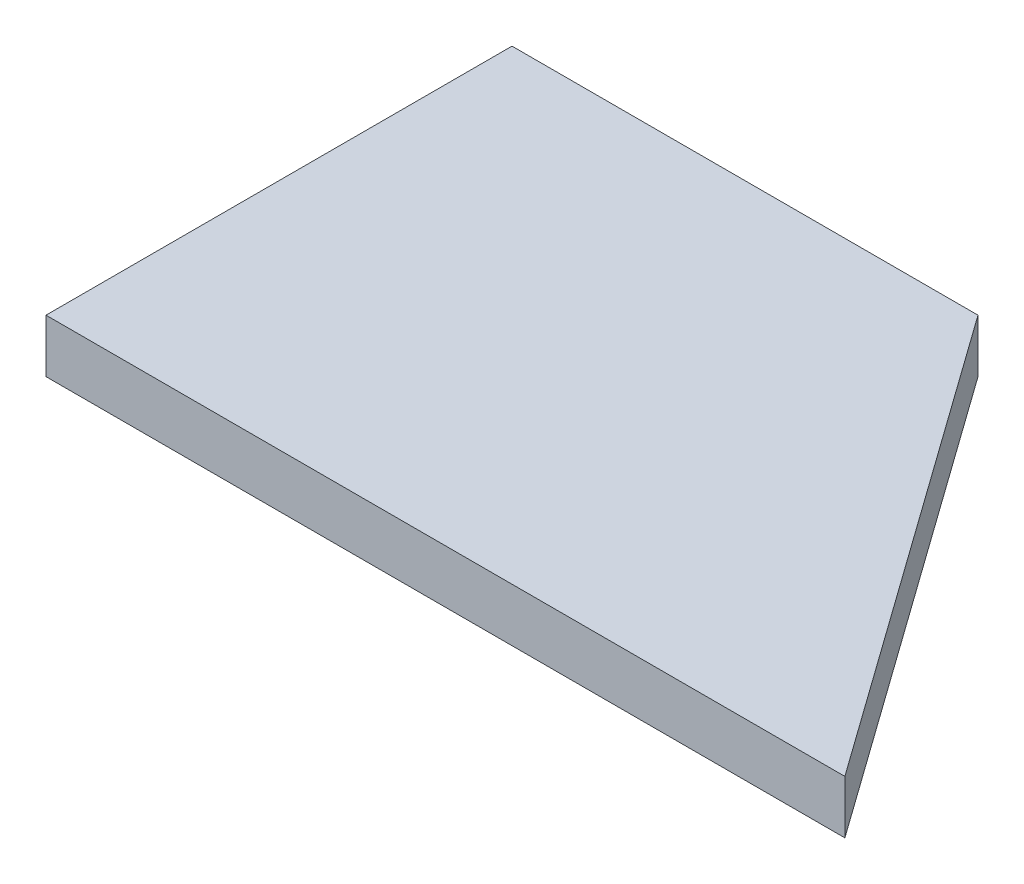
ISO-10303-21;
HEADER;
FILE_DESCRIPTION(('STEP AP214'),'2;1');
FILE_NAME('part.step','',(''),(''),'','','');
FILE_SCHEMA(('AUTOMOTIVE_DESIGN { 1 0 10303 214 1 1 1 1 }'));
ENDSEC;
DATA;
#1=APPLICATION_CONTEXT('core data for automotive mechanical design processes');
#2=APPLICATION_PROTOCOL_DEFINITION('international standard','automotive_design',2000,#1);
#3=PRODUCT_CONTEXT('',#1,'mechanical');
#4=PRODUCT('Part','Part','',(#3));
#5=PRODUCT_RELATED_PRODUCT_CATEGORY('part','',(#4));
#6=PRODUCT_DEFINITION_FORMATION('','',#4);
#7=PRODUCT_DEFINITION_CONTEXT('part definition',#1,'design');
#8=PRODUCT_DEFINITION('design','',#6,#7);
#9=PRODUCT_DEFINITION_SHAPE('','',#8);
#10=(LENGTH_UNIT() NAMED_UNIT(*) SI_UNIT(.MILLI.,.METRE.));
#11=(NAMED_UNIT(*) PLANE_ANGLE_UNIT() SI_UNIT($,.RADIAN.));
#12=(NAMED_UNIT(*) SI_UNIT($,.STERADIAN.) SOLID_ANGLE_UNIT());
#13=UNCERTAINTY_MEASURE_WITH_UNIT(LENGTH_MEASURE(1.E-05),#10,'distance_accuracy_value','');
#14=(GEOMETRIC_REPRESENTATION_CONTEXT(3) GLOBAL_UNCERTAINTY_ASSIGNED_CONTEXT((#13)) GLOBAL_UNIT_ASSIGNED_CONTEXT((#10,
#11,#12)) REPRESENTATION_CONTEXT('',''));
#15=CARTESIAN_POINT('',(0.,0.,0.));
#16=DIRECTION('',(0.,0.,1.));
#17=DIRECTION('',(1.,0.,0.));
#18=AXIS2_PLACEMENT_3D('',#15,#16,#17);
#19=CARTESIAN_POINT('',(0.,8.,0.));
#20=DIRECTION('',(1.,0.,0.));
#21=DIRECTION('',(0.,0.,-1.));
#22=AXIS2_PLACEMENT_3D('',#19,#20,#21);
#23=PLANE('',#22);
#24=DIRECTION('',(0.,0.,1.));
#25=VECTOR('',#24,1.);
#26=CARTESIAN_POINT('',(0.,0.,0.));
#27=LINE('',#26,#25);
#28=CARTESIAN_POINT('',(0.,0.,-70.));
#29=VERTEX_POINT('',#28);
#30=CARTESIAN_POINT('',(0.,0.,0.));
#31=VERTEX_POINT('',#30);
#32=EDGE_CURVE('E97',#29,#31,#27,.T.);
#33=ORIENTED_EDGE('',*,*,#32,.T.);
#34=DIRECTION('',(0.,-1.,0.));
#35=VECTOR('',#34,1.);
#36=CARTESIAN_POINT('',(0.,8.,0.));
#37=LINE('',#36,#35);
#38=CARTESIAN_POINT('',(0.,8.,0.));
#39=VERTEX_POINT('',#38);
#40=EDGE_CURVE('E11',#39,#31,#37,.T.);
#41=ORIENTED_EDGE('',*,*,#40,.F.);
#42=DIRECTION('',(0.,0.,1.));
#43=VECTOR('',#42,1.);
#44=CARTESIAN_POINT('',(0.,8.,0.));
#45=LINE('',#44,#43);
#46=CARTESIAN_POINT('',(0.,8.,-70.));
#47=VERTEX_POINT('',#46);
#48=EDGE_CURVE('E85',#47,#39,#45,.T.);
#49=ORIENTED_EDGE('',*,*,#48,.F.);
#50=DIRECTION('',(0.,-1.,0.));
#51=VECTOR('',#50,1.);
#52=CARTESIAN_POINT('',(0.,8.,-70.));
#53=LINE('',#52,#51);
#54=EDGE_CURVE('E93',#47,#29,#53,.T.);
#55=ORIENTED_EDGE('',*,*,#54,.T.);
#56=EDGE_LOOP('',(#33,#41,#49,#55));
#57=FACE_BOUND('',#56,.T.);
#58=ADVANCED_FACE('F34',(#57),#23,.F.);
#59=CARTESIAN_POINT('',(0.,8.,0.));
#60=DIRECTION('',(0.,0.,-1.));
#61=DIRECTION('',(-1.,0.,0.));
#62=AXIS2_PLACEMENT_3D('',#59,#60,#61);
#63=PLANE('',#62);
#64=DIRECTION('',(1.,0.,0.));
#65=VECTOR('',#64,1.);
#66=CARTESIAN_POINT('',(0.,0.,0.));
#67=LINE('',#66,#65);
#68=CARTESIAN_POINT('',(120.,0.,0.));
#69=VERTEX_POINT('',#68);
#70=EDGE_CURVE('E89',#31,#69,#67,.T.);
#71=ORIENTED_EDGE('',*,*,#70,.T.);
#72=DIRECTION('',(0.,-1.,0.));
#73=VECTOR('',#72,1.);
#74=CARTESIAN_POINT('',(120.,8.,0.));
#75=LINE('',#74,#73);
#76=CARTESIAN_POINT('',(120.,8.,0.));
#77=VERTEX_POINT('',#76);
#78=EDGE_CURVE('E42',#77,#69,#75,.T.);
#79=ORIENTED_EDGE('',*,*,#78,.F.);
#80=DIRECTION('',(1.,0.,0.));
#81=VECTOR('',#80,1.);
#82=CARTESIAN_POINT('',(0.,8.,0.));
#83=LINE('',#82,#81);
#84=EDGE_CURVE('E80',#39,#77,#83,.T.);
#85=ORIENTED_EDGE('',*,*,#84,.F.);
#86=ORIENTED_EDGE('',*,*,#40,.T.);
#87=EDGE_LOOP('',(#71,#79,#85,#86));
#88=FACE_BOUND('',#87,.T.);
#89=ADVANCED_FACE('F88',(#88),#63,.F.);
#90=CARTESIAN_POINT('',(70.,8.,-70.));
#91=DIRECTION('',(-0.813733471206735,0.,0.581238193719096));
#92=DIRECTION('',(0.581238193719096,0.,0.813733471206735));
#93=AXIS2_PLACEMENT_3D('',#90,#91,#92);
#94=PLANE('',#93);
#95=DIRECTION('',(-0.581238193719096,0.,-0.813733471206735));
#96=VECTOR('',#95,1.);
#97=CARTESIAN_POINT('',(70.,0.,-70.));
#98=LINE('',#97,#96);
#99=CARTESIAN_POINT('',(70.,0.,-70.));
#100=VERTEX_POINT('',#99);
#101=EDGE_CURVE('E67',#69,#100,#98,.T.);
#102=ORIENTED_EDGE('',*,*,#101,.T.);
#103=DIRECTION('',(0.,-1.,0.));
#104=VECTOR('',#103,1.);
#105=CARTESIAN_POINT('',(70.,8.,-70.));
#106=LINE('',#105,#104);
#107=CARTESIAN_POINT('',(70.,8.,-70.));
#108=VERTEX_POINT('',#107);
#109=EDGE_CURVE('E90',#108,#100,#106,.T.);
#110=ORIENTED_EDGE('',*,*,#109,.F.);
#111=DIRECTION('',(-0.581238193719096,0.,-0.813733471206735));
#112=VECTOR('',#111,1.);
#113=CARTESIAN_POINT('',(70.,8.,-70.));
#114=LINE('',#113,#112);
#115=EDGE_CURVE('E83',#77,#108,#114,.T.);
#116=ORIENTED_EDGE('',*,*,#115,.F.);
#117=ORIENTED_EDGE('',*,*,#78,.T.);
#118=EDGE_LOOP('',(#102,#110,#116,#117));
#119=FACE_BOUND('',#118,.T.);
#120=ADVANCED_FACE('F91',(#119),#94,.F.);
#121=CARTESIAN_POINT('',(0.,8.,-70.));
#122=DIRECTION('',(0.,0.,1.));
#123=DIRECTION('',(1.,0.,0.));
#124=AXIS2_PLACEMENT_3D('',#121,#122,#123);
#125=PLANE('',#124);
#126=DIRECTION('',(-1.,0.,0.));
#127=VECTOR('',#126,1.);
#128=CARTESIAN_POINT('',(0.,0.,-70.));
#129=LINE('',#128,#127);
#130=EDGE_CURVE('E73',#100,#29,#129,.T.);
#131=ORIENTED_EDGE('',*,*,#130,.T.);
#132=ORIENTED_EDGE('',*,*,#54,.F.);
#133=DIRECTION('',(-1.,0.,0.));
#134=VECTOR('',#133,1.);
#135=CARTESIAN_POINT('',(0.,8.,-70.));
#136=LINE('',#135,#134);
#137=EDGE_CURVE('E50',#108,#47,#136,.T.);
#138=ORIENTED_EDGE('',*,*,#137,.F.);
#139=ORIENTED_EDGE('',*,*,#109,.T.);
#140=EDGE_LOOP('',(#131,#132,#138,#139));
#141=FACE_BOUND('',#140,.T.);
#142=ADVANCED_FACE('F104',(#141),#125,.F.);
#143=CARTESIAN_POINT('',(0.,8.,0.));
#144=DIRECTION('',(0.,-1.,0.));
#145=DIRECTION('',(0.,0.,-1.));
#146=AXIS2_PLACEMENT_3D('',#143,#144,#145);
#147=PLANE('',#146);
#148=ORIENTED_EDGE('',*,*,#48,.T.);
#149=ORIENTED_EDGE('',*,*,#84,.T.);
#150=ORIENTED_EDGE('',*,*,#115,.T.);
#151=ORIENTED_EDGE('',*,*,#137,.T.);
#152=EDGE_LOOP('',(#148,#149,#150,#151));
#153=FACE_BOUND('',#152,.T.);
#154=ADVANCED_FACE('F81',(#153),#147,.F.);
#155=CARTESIAN_POINT('',(0.,0.,0.));
#156=DIRECTION('',(0.,-1.,0.));
#157=DIRECTION('',(0.,0.,-1.));
#158=AXIS2_PLACEMENT_3D('',#155,#156,#157);
#159=PLANE('',#158);
#160=ORIENTED_EDGE('',*,*,#32,.F.);
#161=ORIENTED_EDGE('',*,*,#130,.F.);
#162=ORIENTED_EDGE('',*,*,#101,.F.);
#163=ORIENTED_EDGE('',*,*,#70,.F.);
#164=EDGE_LOOP('',(#160,#161,#162,#163));
#165=FACE_BOUND('',#164,.T.);
#166=ADVANCED_FACE('F107',(#165),#159,.T.);
#167=CLOSED_SHELL('',(#58,#89,#120,#142,#154,#166));
#168=MANIFOLD_SOLID_BREP('B2',#167);
#169=ADVANCED_BREP_SHAPE_REPRESENTATION('',(#18,#168),#14);
#170=SHAPE_DEFINITION_REPRESENTATION(#9,#169);
ENDSEC;
END-ISO-10303-21;
